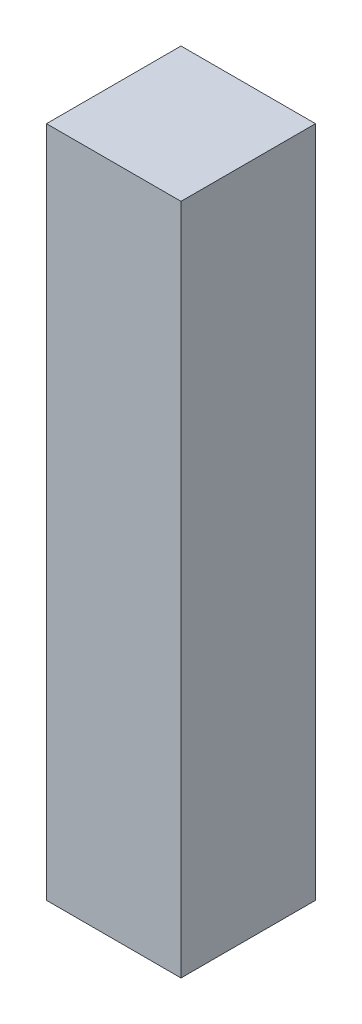
ISO-10303-21;
HEADER;
FILE_DESCRIPTION(('STEP AP214'),'2;1');
FILE_NAME('part.step','',(''),(''),'','','');
FILE_SCHEMA(('AUTOMOTIVE_DESIGN { 1 0 10303 214 1 1 1 1 }'));
ENDSEC;
DATA;
#1=APPLICATION_CONTEXT('core data for automotive mechanical design processes');
#2=APPLICATION_PROTOCOL_DEFINITION('international standard','automotive_design',2000,#1);
#3=PRODUCT_CONTEXT('',#1,'mechanical');
#4=PRODUCT('Part','Part','',(#3));
#5=PRODUCT_RELATED_PRODUCT_CATEGORY('part','',(#4));
#6=PRODUCT_DEFINITION_FORMATION('','',#4);
#7=PRODUCT_DEFINITION_CONTEXT('part definition',#1,'design');
#8=PRODUCT_DEFINITION('design','',#6,#7);
#9=PRODUCT_DEFINITION_SHAPE('','',#8);
#10=(LENGTH_UNIT() NAMED_UNIT(*) SI_UNIT(.MILLI.,.METRE.));
#11=(NAMED_UNIT(*) PLANE_ANGLE_UNIT() SI_UNIT($,.RADIAN.));
#12=(NAMED_UNIT(*) SI_UNIT($,.STERADIAN.) SOLID_ANGLE_UNIT());
#13=UNCERTAINTY_MEASURE_WITH_UNIT(LENGTH_MEASURE(1.E-05),#10,'distance_accuracy_value','');
#14=(GEOMETRIC_REPRESENTATION_CONTEXT(3) GLOBAL_UNCERTAINTY_ASSIGNED_CONTEXT((#13)) GLOBAL_UNIT_ASSIGNED_CONTEXT((#10,
#11,#12)) REPRESENTATION_CONTEXT('',''));
#15=CARTESIAN_POINT('',(0.,0.,0.));
#16=DIRECTION('',(0.,0.,1.));
#17=DIRECTION('',(1.,0.,0.));
#18=AXIS2_PLACEMENT_3D('',#15,#16,#17);
#19=CARTESIAN_POINT('',(20.,200.,-20.));
#20=DIRECTION('',(-1.,0.,0.));
#21=DIRECTION('',(0.,0.,1.));
#22=AXIS2_PLACEMENT_3D('',#19,#20,#21);
#23=PLANE('',#22);
#24=DIRECTION('',(0.,0.,-1.));
#25=VECTOR('',#24,1.);
#26=CARTESIAN_POINT('',(20.,0.,-20.));
#27=LINE('',#26,#25);
#28=CARTESIAN_POINT('',(20.,0.,20.));
#29=VERTEX_POINT('',#28);
#30=CARTESIAN_POINT('',(20.,0.,-20.));
#31=VERTEX_POINT('',#30);
#32=EDGE_CURVE('E113',#29,#31,#27,.T.);
#33=ORIENTED_EDGE('',*,*,#32,.T.);
#34=DIRECTION('',(0.,-1.,0.));
#35=VECTOR('',#34,1.);
#36=CARTESIAN_POINT('',(20.,200.,-20.));
#37=LINE('',#36,#35);
#38=CARTESIAN_POINT('',(20.,200.,-20.));
#39=VERTEX_POINT('',#38);
#40=EDGE_CURVE('E11',#39,#31,#37,.T.);
#41=ORIENTED_EDGE('',*,*,#40,.F.);
#42=DIRECTION('',(0.,0.,-1.));
#43=VECTOR('',#42,1.);
#44=CARTESIAN_POINT('',(20.,200.,-20.));
#45=LINE('',#44,#43);
#46=CARTESIAN_POINT('',(20.,200.,20.));
#47=VERTEX_POINT('',#46);
#48=EDGE_CURVE('E97',#47,#39,#45,.T.);
#49=ORIENTED_EDGE('',*,*,#48,.F.);
#50=DIRECTION('',(0.,-1.,0.));
#51=VECTOR('',#50,1.);
#52=CARTESIAN_POINT('',(20.,200.,20.));
#53=LINE('',#52,#51);
#54=EDGE_CURVE('E109',#47,#29,#53,.T.);
#55=ORIENTED_EDGE('',*,*,#54,.T.);
#56=EDGE_LOOP('',(#33,#41,#49,#55));
#57=FACE_BOUND('',#56,.T.);
#58=ADVANCED_FACE('F45',(#57),#23,.F.);
#59=CARTESIAN_POINT('',(-20.,200.,-20.));
#60=DIRECTION('',(0.,0.,1.));
#61=DIRECTION('',(1.,0.,0.));
#62=AXIS2_PLACEMENT_3D('',#59,#60,#61);
#63=PLANE('',#62);
#64=DIRECTION('',(-1.,0.,0.));
#65=VECTOR('',#64,1.);
#66=CARTESIAN_POINT('',(-20.,0.,-20.));
#67=LINE('',#66,#65);
#68=CARTESIAN_POINT('',(-20.,0.,-20.));
#69=VERTEX_POINT('',#68);
#70=EDGE_CURVE('E102',#31,#69,#67,.T.);
#71=ORIENTED_EDGE('',*,*,#70,.T.);
#72=DIRECTION('',(0.,-1.,0.));
#73=VECTOR('',#72,1.);
#74=CARTESIAN_POINT('',(-20.,200.,-20.));
#75=LINE('',#74,#73);
#76=CARTESIAN_POINT('',(-20.,200.,-20.));
#77=VERTEX_POINT('',#76);
#78=EDGE_CURVE('E54',#77,#69,#75,.T.);
#79=ORIENTED_EDGE('',*,*,#78,.F.);
#80=DIRECTION('',(-1.,0.,0.));
#81=VECTOR('',#80,1.);
#82=CARTESIAN_POINT('',(-20.,200.,-20.));
#83=LINE('',#82,#81);
#84=EDGE_CURVE('E92',#39,#77,#83,.T.);
#85=ORIENTED_EDGE('',*,*,#84,.F.);
#86=ORIENTED_EDGE('',*,*,#40,.T.);
#87=EDGE_LOOP('',(#71,#79,#85,#86));
#88=FACE_BOUND('',#87,.T.);
#89=ADVANCED_FACE('F101',(#88),#63,.F.);
#90=CARTESIAN_POINT('',(-20.,200.,-20.));
#91=DIRECTION('',(1.,0.,0.));
#92=DIRECTION('',(0.,0.,-1.));
#93=AXIS2_PLACEMENT_3D('',#90,#91,#92);
#94=PLANE('',#93);
#95=DIRECTION('',(0.,0.,1.));
#96=VECTOR('',#95,1.);
#97=CARTESIAN_POINT('',(-20.,0.,-20.));
#98=LINE('',#97,#96);
#99=CARTESIAN_POINT('',(-20.,0.,20.));
#100=VERTEX_POINT('',#99);
#101=EDGE_CURVE('E79',#69,#100,#98,.T.);
#102=ORIENTED_EDGE('',*,*,#101,.T.);
#103=DIRECTION('',(0.,-1.,0.));
#104=VECTOR('',#103,1.);
#105=CARTESIAN_POINT('',(-20.,200.,20.));
#106=LINE('',#105,#104);
#107=CARTESIAN_POINT('',(-20.,200.,20.));
#108=VERTEX_POINT('',#107);
#109=EDGE_CURVE('E104',#108,#100,#106,.T.);
#110=ORIENTED_EDGE('',*,*,#109,.F.);
#111=DIRECTION('',(0.,0.,1.));
#112=VECTOR('',#111,1.);
#113=CARTESIAN_POINT('',(-20.,200.,-20.));
#114=LINE('',#113,#112);
#115=EDGE_CURVE('E95',#77,#108,#114,.T.);
#116=ORIENTED_EDGE('',*,*,#115,.F.);
#117=ORIENTED_EDGE('',*,*,#78,.T.);
#118=EDGE_LOOP('',(#102,#110,#116,#117));
#119=FACE_BOUND('',#118,.T.);
#120=ADVANCED_FACE('F105',(#119),#94,.F.);
#121=CARTESIAN_POINT('',(-20.,200.,20.));
#122=DIRECTION('',(0.,0.,-1.));
#123=DIRECTION('',(-1.,0.,0.));
#124=AXIS2_PLACEMENT_3D('',#121,#122,#123);
#125=PLANE('',#124);
#126=DIRECTION('',(1.,0.,0.));
#127=VECTOR('',#126,1.);
#128=CARTESIAN_POINT('',(-20.,0.,20.));
#129=LINE('',#128,#127);
#130=EDGE_CURVE('E85',#100,#29,#129,.T.);
#131=ORIENTED_EDGE('',*,*,#130,.T.);
#132=ORIENTED_EDGE('',*,*,#54,.F.);
#133=DIRECTION('',(1.,0.,0.));
#134=VECTOR('',#133,1.);
#135=CARTESIAN_POINT('',(-20.,200.,20.));
#136=LINE('',#135,#134);
#137=EDGE_CURVE('E62',#108,#47,#136,.T.);
#138=ORIENTED_EDGE('',*,*,#137,.F.);
#139=ORIENTED_EDGE('',*,*,#109,.T.);
#140=EDGE_LOOP('',(#131,#132,#138,#139));
#141=FACE_BOUND('',#140,.T.);
#142=ADVANCED_FACE('F126',(#141),#125,.F.);
#143=CARTESIAN_POINT('',(0.,200.,0.));
#144=DIRECTION('',(0.,1.,0.));
#145=DIRECTION('',(0.,0.,1.));
#146=AXIS2_PLACEMENT_3D('',#143,#144,#145);
#147=PLANE('',#146);
#148=ORIENTED_EDGE('',*,*,#48,.T.);
#149=ORIENTED_EDGE('',*,*,#84,.T.);
#150=ORIENTED_EDGE('',*,*,#115,.T.);
#151=ORIENTED_EDGE('',*,*,#137,.T.);
#152=EDGE_LOOP('',(#148,#149,#150,#151));
#153=FACE_BOUND('',#152,.T.);
#154=ADVANCED_FACE('F93',(#153),#147,.T.);
#155=CARTESIAN_POINT('',(0.,0.,0.));
#156=DIRECTION('',(0.,1.,0.));
#157=DIRECTION('',(0.,0.,1.));
#158=AXIS2_PLACEMENT_3D('',#155,#156,#157);
#159=PLANE('',#158);
#160=ORIENTED_EDGE('',*,*,#32,.F.);
#161=ORIENTED_EDGE('',*,*,#130,.F.);
#162=ORIENTED_EDGE('',*,*,#101,.F.);
#163=ORIENTED_EDGE('',*,*,#70,.F.);
#164=EDGE_LOOP('',(#160,#161,#162,#163));
#165=FACE_BOUND('',#164,.T.);
#166=ADVANCED_FACE('F129',(#165),#159,.F.);
#167=CLOSED_SHELL('',(#58,#89,#120,#142,#154,#166));
#168=MANIFOLD_SOLID_BREP('B2',#167);
#169=ADVANCED_BREP_SHAPE_REPRESENTATION('',(#18,#168),#14);
#170=SHAPE_DEFINITION_REPRESENTATION(#9,#169);
ENDSEC;
END-ISO-10303-21;
